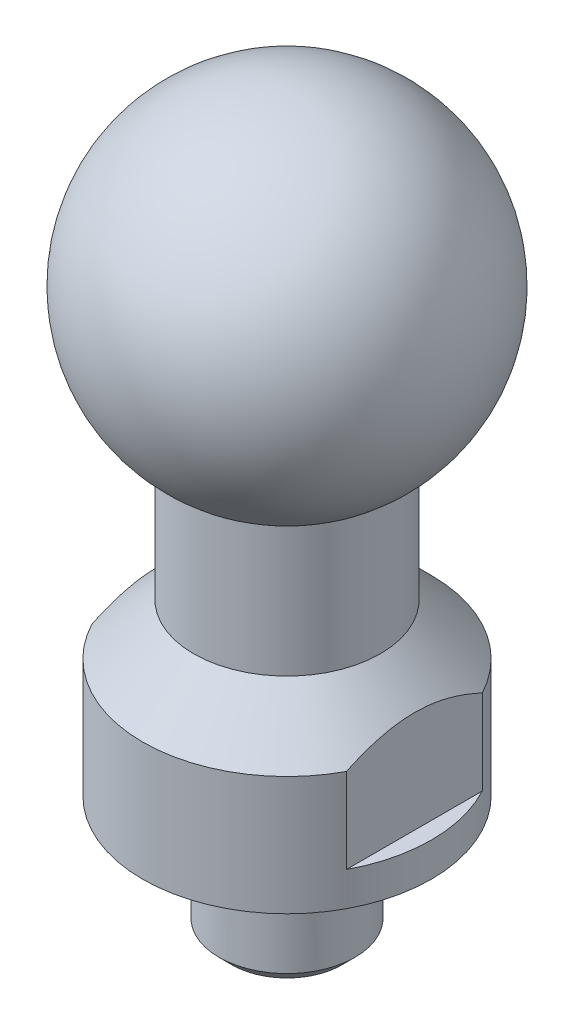
ISO-10303-21;
HEADER;
FILE_DESCRIPTION(('STEP AP214'),'2;1');
FILE_NAME('part.step','',(''),(''),'','','');
FILE_SCHEMA(('AUTOMOTIVE_DESIGN { 1 0 10303 214 1 1 1 1 }'));
ENDSEC;
DATA;
#1=APPLICATION_CONTEXT('core data for automotive mechanical design processes');
#2=APPLICATION_PROTOCOL_DEFINITION('international standard','automotive_design',2000,#1);
#3=PRODUCT_CONTEXT('',#1,'mechanical');
#4=PRODUCT('Part','Part','',(#3));
#5=PRODUCT_RELATED_PRODUCT_CATEGORY('part','',(#4));
#6=PRODUCT_DEFINITION_FORMATION('','',#4);
#7=PRODUCT_DEFINITION_CONTEXT('part definition',#1,'design');
#8=PRODUCT_DEFINITION('design','',#6,#7);
#9=PRODUCT_DEFINITION_SHAPE('','',#8);
#10=(LENGTH_UNIT() NAMED_UNIT(*) SI_UNIT(.MILLI.,.METRE.));
#11=(NAMED_UNIT(*) PLANE_ANGLE_UNIT() SI_UNIT($,.RADIAN.));
#12=(NAMED_UNIT(*) SI_UNIT($,.STERADIAN.) SOLID_ANGLE_UNIT());
#13=UNCERTAINTY_MEASURE_WITH_UNIT(LENGTH_MEASURE(1.E-05),#10,'distance_accuracy_value','');
#14=(GEOMETRIC_REPRESENTATION_CONTEXT(3) GLOBAL_UNCERTAINTY_ASSIGNED_CONTEXT((#13)) GLOBAL_UNIT_ASSIGNED_CONTEXT((#10,
#11,#12)) REPRESENTATION_CONTEXT('',''));
#15=CARTESIAN_POINT('',(0.,0.,0.));
#16=DIRECTION('',(0.,0.,1.));
#17=DIRECTION('',(1.,0.,0.));
#18=AXIS2_PLACEMENT_3D('',#15,#16,#17);
#19=CARTESIAN_POINT('',(-3.233,48.,-3.233));
#20=DIRECTION('',(0.,-1.,0.));
#21=DIRECTION('',(1.,0.,0.));
#22=AXIS2_PLACEMENT_3D('',#19,#20,#21);
#23=PLANE('',#22);
#24=CARTESIAN_POINT('',(0.,48.,0.));
#25=DIRECTION('',(0.,-1.,0.));
#26=DIRECTION('',(0.,0.,1.));
#27=AXIS2_PLACEMENT_3D('',#24,#25,#26);
#28=CIRCLE('',#27,3.233);
#29=CARTESIAN_POINT('',(0.,48.,3.233));
#30=VERTEX_POINT('',#29);
#31=EDGE_CURVE('E185',#30,#30,#28,.F.);
#32=ORIENTED_EDGE('',*,*,#31,.F.);
#33=EDGE_LOOP('',(#32));
#34=FACE_BOUND('',#33,.T.);
#35=ADVANCED_FACE('F17',(#34),#23,.T.);
#36=CARTESIAN_POINT('',(-8.73225364009987,55.,-8.5));
#37=DIRECTION('',(0.,-1.,0.));
#38=DIRECTION('',(1.,0.,0.));
#39=AXIS2_PLACEMENT_3D('',#36,#37,#38);
#40=PLANE('',#39);
#41=CARTESIAN_POINT('',(0.,55.,0.));
#42=DIRECTION('',(0.,-1.,0.));
#43=DIRECTION('',(0.,0.,1.));
#44=AXIS2_PLACEMENT_3D('',#41,#42,#43);
#45=CIRCLE('',#44,8.5);
#46=CARTESIAN_POINT('',(0.,55.,8.5));
#47=VERTEX_POINT('',#46);
#48=EDGE_CURVE('E80',#47,#47,#45,.F.);
#49=ORIENTED_EDGE('',*,*,#48,.F.);
#50=EDGE_LOOP('',(#49));
#51=FACE_BOUND('',#50,.T.);
#52=CARTESIAN_POINT('',(0.,55.,0.));
#53=DIRECTION('',(0.,1.,0.));
#54=DIRECTION('',(0.,0.,-1.));
#55=AXIS2_PLACEMENT_3D('',#52,#53,#54);
#56=CIRCLE('',#55,4.);
#57=CARTESIAN_POINT('',(0.,55.,-4.));
#58=VERTEX_POINT('',#57);
#59=EDGE_CURVE('E77',#58,#58,#56,.T.);
#60=ORIENTED_EDGE('',*,*,#59,.T.);
#61=EDGE_LOOP('',(#60));
#62=FACE_BOUND('',#61,.T.);
#63=ADVANCED_FACE('F103',(#51,#62),#40,.T.);
#64=CARTESIAN_POINT('',(-7.5,57.,4.00000000114937));
#65=DIRECTION('',(-1.,0.,0.));
#66=DIRECTION('',(0.,1.,0.));
#67=AXIS2_PLACEMENT_3D('',#64,#65,#66);
#68=PLANE('',#67);
#69=DIRECTION('',(0.,0.,1.));
#70=VECTOR('',#69,1.);
#71=CARTESIAN_POINT('',(-7.5,57.,-4.));
#72=LINE('',#71,#70);
#73=CARTESIAN_POINT('',(-7.5,57.,-4.));
#74=VERTEX_POINT('',#73);
#75=CARTESIAN_POINT('',(-7.5,57.,4.));
#76=VERTEX_POINT('',#75);
#77=EDGE_CURVE('E68',#74,#76,#72,.T.);
#78=ORIENTED_EDGE('',*,*,#77,.T.);
#79=DIRECTION('',(0.,1.,2.29873720086967E-10));
#80=VECTOR('',#79,1.);
#81=CARTESIAN_POINT('',(-7.5,57.,4.));
#82=LINE('',#81,#80);
#83=CARTESIAN_POINT('',(-7.5,61.9999999993918,4.00000000114937));
#84=VERTEX_POINT('',#83);
#85=EDGE_CURVE('E56',#84,#76,#82,.F.);
#86=ORIENTED_EDGE('',*,*,#85,.F.);
#87=CARTESIAN_POINT('',(-7.49999999999995,62.0000000219633,-3.99999995332805));
#88=CARTESIAN_POINT('',(-7.50000001463122,62.0168374619799,-3.96422028065112));
#89=CARTESIAN_POINT('',(-7.50000021288068,62.0335308730521,-3.92837273513309));
#90=CARTESIAN_POINT('',(-7.50000064954804,62.0667491959796,-3.85626007169311));
#91=CARTESIAN_POINT('',(-7.5000008882675,62.0832717742129,-3.8199938788956));
#92=CARTESIAN_POINT('',(-7.50000106891966,62.1161262201853,-3.74705105900949));
#93=CARTESIAN_POINT('',(-7.50000100863585,62.1324557614171,-3.71037338370133));
#94=CARTESIAN_POINT('',(-7.50000031502889,62.1649018458054,-3.63661397478704));
#95=CARTESIAN_POINT('',(-7.49999967765433,62.1810160644761,-3.59953121842838));
#96=CARTESIAN_POINT('',(-7.49999764228953,62.2130092056872,-3.52496716258381));
#97=CARTESIAN_POINT('',(-7.49999623918447,62.2288857999319,-3.48748486383744));
#98=CARTESIAN_POINT('',(-7.49999233042079,62.2603815436639,-3.41212641594515));
#99=CARTESIAN_POINT('',(-7.49998981766852,62.2759983548218,-3.37424928922651));
#100=CARTESIAN_POINT('',(-7.49998407200913,62.3069518277154,-3.29810472301365));
#101=CARTESIAN_POINT('',(-7.49998083469952,62.3222861287187,-3.25983632359907));
#102=CARTESIAN_POINT('',(-7.49997138039632,62.352547876092,-3.18318147215675));
#103=CARTESIAN_POINT('',(-7.49996516627001,62.3674756993924,-3.14479516897231));
#104=CARTESIAN_POINT('',(-7.49995122278917,62.3968132294981,-3.06816084079637));
#105=CARTESIAN_POINT('',(-7.49994350536442,62.4112260217123,-3.02991399737312));
#106=CARTESIAN_POINT('',(-7.4999298161044,62.4395362583751,-2.95353645677785));
#107=CARTESIAN_POINT('',(-7.49992383234945,62.4534366190715,-2.91540684092237));
#108=CARTESIAN_POINT('',(-7.49991519866905,62.4807253623381,-2.83924174399878));
#109=CARTESIAN_POINT('',(-7.49991252752266,62.4941164654708,-2.80120723798125));
#110=CARTESIAN_POINT('',(-7.49991134483756,62.520389930452,-2.72521019173225));
#111=CARTESIAN_POINT('',(-7.49991280922022,62.533274796182,-2.68724851740818));
#112=CARTESIAN_POINT('',(-7.4999197013677,62.5585390923869,-2.61137489292846));
#113=CARTESIAN_POINT('',(-7.49992510863815,62.5709207882467,-2.57346369732167));
#114=CARTESIAN_POINT('',(-7.49993875925235,62.5951820360946,-2.49766869498664));
#115=CARTESIAN_POINT('',(-7.49994698974328,62.6070635944275,-2.45978553064538));
#116=CARTESIAN_POINT('',(-7.49996406907078,62.6303279747492,-2.38402420860664));
#117=CARTESIAN_POINT('',(-7.49997291543268,62.641712524033,-2.34614658146009));
#118=CARTESIAN_POINT('',(-7.49998840174655,62.6639859671589,-2.27037379056723));
#119=CARTESIAN_POINT('',(-7.49999504847408,62.6748762922166,-2.23247904762039));
#120=CARTESIAN_POINT('',(-7.50000086739725,62.6961566652666,-2.15668184642589));
#121=CARTESIAN_POINT('',(-7.50000006375525,62.7065482206816,-2.11877981147924));
#122=CARTESIAN_POINT('',(-7.49998942224655,62.7267958212251,-2.04308193386561));
#123=CARTESIAN_POINT('',(-7.49997963981357,62.7366547596196,-2.00528686542144));
#124=CARTESIAN_POINT('',(-7.49995778978801,62.7558325263098,-1.92978971950365));
#125=CARTESIAN_POINT('',(-7.49994573557135,62.7651541187462,-1.89208834455705));
#126=CARTESIAN_POINT('',(-7.49992279335406,62.783259088784,-1.81674955317861));
#127=CARTESIAN_POINT('',(-7.49991189999037,62.7920448533838,-1.77911271063529));
#128=CARTESIAN_POINT('',(-7.49989384143082,62.8090796553806,-1.70387367108459));
#129=CARTESIAN_POINT('',(-7.49988666170669,62.817330672172,-1.66627192243619));
#130=CARTESIAN_POINT('',(-7.49987710755488,62.8332975746705,-1.59107363727844));
#131=CARTESIAN_POINT('',(-7.49987471867691,62.841015001605,-1.55347742814708));
#132=CARTESIAN_POINT('',(-7.49987428537818,62.8559164801745,-1.47826066980947));
#133=CARTESIAN_POINT('',(-7.49987623193273,62.8631016076748,-1.44064033382668));
#134=CARTESIAN_POINT('',(-7.4998832132571,62.8769396719196,-1.36534554224119));
#135=CARTESIAN_POINT('',(-7.49988824455781,62.883593197016,-1.32767119479529));
#136=CARTESIAN_POINT('',(-7.49989635252834,62.8963558271727,-1.25233147122707));
#137=CARTESIAN_POINT('',(-7.49989943426241,62.902466307035,-1.21466632803295));
#138=CARTESIAN_POINT('',(-7.49990111389451,62.9141230092742,-1.13946696246711));
#139=CARTESIAN_POINT('',(-7.49989973705763,62.9196722279591,-1.10193320473289));
#140=CARTESIAN_POINT('',(-7.49989438440453,62.9302077112456,-1.02699004645005));
#141=CARTESIAN_POINT('',(-7.49989042243359,62.9351968098005,-0.989581044487302));
#142=CARTESIAN_POINT('',(-7.4998805436856,62.9446147078005,-0.91487970352287));
#143=CARTESIAN_POINT('',(-7.49987463663167,62.949046145602,-0.877587697284088));
#144=CARTESIAN_POINT('',(-7.49986172419869,62.9573510922447,-0.803112595905516));
#145=CARTESIAN_POINT('',(-7.49985472391575,62.9612270373293,-0.765929772558849));
#146=CARTESIAN_POINT('',(-7.49984030346297,62.9684234544924,-0.69166530415843));
#147=CARTESIAN_POINT('',(-7.49983288514555,62.9717461533264,-0.654583874975737));
#148=CARTESIAN_POINT('',(-7.4998182300966,62.9778385199194,-0.580514480524382));
#149=CARTESIAN_POINT('',(-7.49981099279218,62.9806101991395,-0.543526680775037));
#150=CARTESIAN_POINT('',(-7.49979719624348,62.9856029795454,-0.469636869249525));
#151=CARTESIAN_POINT('',(-7.49979063483484,62.9878258721657,-0.432734978574346));
#152=CARTESIAN_POINT('',(-7.49977858939493,62.9917235353159,-0.359009362245951));
#153=CARTESIAN_POINT('',(-7.49977310230009,62.9933998737962,-0.322185719521686));
#154=CARTESIAN_POINT('',(-7.49976350745321,62.9962068881058,-0.24860904511678));
#155=CARTESIAN_POINT('',(-7.49975939631574,62.9973389062286,-0.211856064667534));
#156=CARTESIAN_POINT('',(-7.49975276143439,62.9990597409537,-0.138413245333529));
#157=CARTESIAN_POINT('',(-7.49975023443329,62.9996496733375,-0.101723432603114));
#158=CARTESIAN_POINT('',(-7.4997468858969,63.0002887982104,-0.0283995792438469));
#159=CARTESIAN_POINT('',(-7.49974606155724,63.000338880436,0.0082344536272907));
#160=CARTESIAN_POINT('',(-7.49974615167809,62.999900765751,0.0814540013830541));
#161=CARTESIAN_POINT('',(-7.49974706398997,62.9994132343069,0.118039520252274));
#162=CARTESIAN_POINT('',(-7.49975058230801,62.9979023508767,0.191169163635874));
#163=CARTESIAN_POINT('',(-7.49975318691038,62.9968794431367,0.227713297333299));
#164=CARTESIAN_POINT('',(-7.49975997364752,62.9943002622738,0.300767148637901));
#165=CARTESIAN_POINT('',(-7.49976415511009,62.9927442164502,0.337276874273833));
#166=CARTESIAN_POINT('',(-7.49977391677313,62.9891012099345,0.41026872776509));
#167=CARTESIAN_POINT('',(-7.49977949693201,62.9870142650241,0.446750856408446));
#168=CARTESIAN_POINT('',(-7.49979182399305,62.9823119050662,0.519694160024269));
#169=CARTESIAN_POINT('',(-7.49979857131285,62.9796963007852,0.556155322792042));
#170=CARTESIAN_POINT('',(-7.49981295790544,62.973939059985,0.629063150710036));
#171=CARTESIAN_POINT('',(-7.49982059783278,62.9707970366968,0.665509785305043));
#172=CARTESIAN_POINT('',(-7.49983646339281,62.9639893879984,0.738394811451343));
#173=CARTESIAN_POINT('',(-7.49984468966471,62.9603231866347,0.774833149183724));
#174=CARTESIAN_POINT('',(-7.49986140244177,62.9524696032783,0.84770762175242));
#175=CARTESIAN_POINT('',(-7.49986988931068,62.9482814652558,0.884143675077914));
#176=CARTESIAN_POINT('',(-7.49988679166888,62.939386420728,0.957019392125729));
#177=CARTESIAN_POINT('',(-7.49989520700094,62.9346785878636,0.993458942732044));
#178=CARTESIAN_POINT('',(-7.49991164243116,62.9247465558443,1.06634722890593));
#179=CARTESIAN_POINT('',(-7.49991966164241,62.9195212702643,1.1027958163735));
#180=CARTESIAN_POINT('',(-7.49993500337748,62.9085567245867,1.17570750082979));
#181=CARTESIAN_POINT('',(-7.49994232413429,62.9028162286564,1.21217041189954));
#182=CARTESIAN_POINT('',(-7.49995600535408,62.8908236432143,1.28511580744281));
#183=CARTESIAN_POINT('',(-7.49996236309829,62.8845701793953,1.32159806588689));
#184=CARTESIAN_POINT('',(-7.49997390833715,62.8715540282568,1.39458694944288));
#185=CARTESIAN_POINT('',(-7.49997909218611,62.8647898392491,1.431093306658));
#186=CARTESIAN_POINT('',(-7.49998815094411,62.8507545960025,1.50413490084196));
#187=CARTESIAN_POINT('',(-7.49999202142214,62.8434819238358,1.54066982680627));
#188=CARTESIAN_POINT('',(-7.4999983997606,62.8284320638267,1.61377278364178));
#189=CARTESIAN_POINT('',(-7.50000090266218,62.8206531529175,1.65034045965652));
#190=CARTESIAN_POINT('',(-7.50000460813351,62.8045931446547,1.72351284261498));
#191=CARTESIAN_POINT('',(-7.50000580566233,62.7963102300078,1.7601171505574));
#192=CARTESIAN_POINT('',(-7.50000704749022,62.7792445672295,1.83336642938422));
#193=CARTESIAN_POINT('',(-7.50000708706627,62.7704599184349,1.87001095730694));
#194=CARTESIAN_POINT('',(-7.50000644910689,62.7523929995572,1.94334396139627));
#195=CARTESIAN_POINT('',(-7.50000576849256,62.7431087553108,1.98003195102396));
#196=CARTESIAN_POINT('',(-7.50000373766662,62.7240453359998,2.0534549850294));
#197=CARTESIAN_POINT('',(-7.50000238446162,62.7142641254793,2.09018950078328));
#198=CARTESIAN_POINT('',(-7.50000130406047,62.6942076183826,2.16370785738439));
#199=CARTESIAN_POINT('',(-7.50000158449339,62.6839302262465,2.20049112634885));
#200=CARTESIAN_POINT('',(-7.49999850258677,62.662910734135,2.27403514096635));
#201=CARTESIAN_POINT('',(-7.49999513012314,62.6521674222576,2.31079554003957));
#202=CARTESIAN_POINT('',(-7.49997810367415,62.6302580294663,2.38419675665137));
#203=CARTESIAN_POINT('',(-7.49996444797883,62.6190918785334,2.42083755328389));
#204=CARTESIAN_POINT('',(-7.49993511443265,62.5963325645677,2.49402141010848));
#205=CARTESIAN_POINT('',(-7.49991943482414,62.5847390367092,2.53056435683159));
#206=CARTESIAN_POINT('',(-7.49988902839279,62.5611240473085,2.60357660544824));
#207=CARTESIAN_POINT('',(-7.49987430314278,62.5491019275468,2.64004569439442));
#208=CARTESIAN_POINT('',(-7.49984877464218,62.5246278339393,2.71293397177265));
#209=CARTESIAN_POINT('',(-7.4998379806181,62.5121749230217,2.74935284549129));
#210=CARTESIAN_POINT('',(-7.4998218910166,62.4868375729323,2.82216443893827));
#211=CARTESIAN_POINT('',(-7.49981661227599,62.4739519356063,2.8585567416198));
#212=CARTESIAN_POINT('',(-7.49981212492918,62.4477473746029,2.93133883891239));
#213=CARTESIAN_POINT('',(-7.49981293910988,62.4344270100797,2.96772811461766));
#214=CARTESIAN_POINT('',(-7.49982014927902,62.4073512177552,3.04052771170189));
#215=CARTESIAN_POINT('',(-7.49982656994466,62.393594125981,3.07693741402575));
#216=CARTESIAN_POINT('',(-7.49984337179488,62.3656431472362,3.14980134841688));
#217=CARTESIAN_POINT('',(-7.49985377296681,62.3514473938044,3.18625486428092));
#218=CARTESIAN_POINT('',(-7.49987621496644,62.3226170763066,3.25922969874048));
#219=CARTESIAN_POINT('',(-7.49988826485498,62.3079804626496,3.29575020733009));
#220=CARTESIAN_POINT('',(-7.4999093814174,62.2782673818433,3.36888259861162));
#221=CARTESIAN_POINT('',(-7.49991842862794,62.2631887090551,3.40549358488521));
#222=CARTESIAN_POINT('',(-7.49993270829738,62.23257129459,3.47886577504936));
#223=CARTESIAN_POINT('',(-7.49993790975204,62.2170298425338,3.51562584776661));
#224=CARTESIAN_POINT('',(-7.49994999746869,62.1854578229835,3.58935681010217));
#225=CARTESIAN_POINT('',(-7.49995689955331,62.1694239769934,3.62632629557568));
#226=CARTESIAN_POINT('',(-7.49996988357649,62.1368652499812,3.70048583393493));
#227=CARTESIAN_POINT('',(-7.49997595670831,62.1203370772316,3.73767444127901));
#228=CARTESIAN_POINT('',(-7.49998670812279,62.086786277869,3.81228093466893));
#229=CARTESIAN_POINT('',(-7.49999137166369,62.0697603396948,3.84969733102076));
#230=CARTESIAN_POINT('',(-7.49999804169047,62.0352109005745,3.92476821350388));
#231=CARTESIAN_POINT('',(-7.50000002025545,62.0176840779032,3.96242117112542));
#232=CARTESIAN_POINT('',(-7.49999999986583,61.9999999995438,4.00000000122092));
#233=B_SPLINE_CURVE_WITH_KNOTS('',3,(#87,#88,#89,#90,#91,#92,#93,#94,#95,#96,#97,#98,#99,#100,
#101,#102,#103,#104,#105,#106,#107,#108,#109,#110,#111,#112,#113,#114,#115,#116,#117,#118,#119,
#120,#121,#122,#123,#124,#125,#126,#127,#128,#129,#130,#131,#132,#133,#134,#135,#136,#137,#138,
#139,#140,#141,#142,#143,#144,#145,#146,#147,#148,#149,#150,#151,#152,#153,#154,#155,#156,#157,
#158,#159,#160,#161,#162,#163,#164,#165,#166,#167,#168,#169,#170,#171,#172,#173,#174,#175,#176,
#177,#178,#179,#180,#181,#182,#183,#184,#185,#186,#187,#188,#189,#190,#191,#192,#193,#194,#195,
#196,#197,#198,#199,#200,#201,#202,#203,#204,#205,#206,#207,#208,#209,#210,#211,#212,#213,#214,
#215,#216,#217,#218,#219,#220,#221,#222,#223,#224,#225,#226,#227,#228,#229,#230,#231,#232),
.UNSPECIFIED.,.F.,.F.,(4,2,2,2,2,2,2,2,2,2,2,2,2,2,2,2,2,2,2,2,2,2,2,2,2,2,2,2,2,2,2,2,2,2,2,2,
2,2,2,2,2,2,2,2,2,2,2,2,2,2,2,2,2,2,2,2,2,2,2,2,2,2,2,2,2,2,2,2,2,2,2,2,4),(0.,
0.118630154590591,0.238186647665221,0.358630733035815,0.479926997992822,0.602043577041708,
0.724952373722351,0.848629290104813,0.972187318721311,1.09480207536367,1.21655263450912,
1.33751914883329,1.45778280454752,1.57742576859305,1.6965311271427,1.81518281587662,
1.9334655426501,2.05136480014215,2.16854102594946,2.28504774961796,2.40099047609246,
2.51647612135798,2.63161290856519,2.74651024956889,2.86127861360982,2.97574761454335,
3.08956909927269,3.20278593594842,3.31544520251707,3.42759417434248,3.53928023583265,
3.65055079001802,3.76145316661057,3.87203452910274,3.98234178148621,4.09242147518346,
4.20231971678796,4.31208207720298,4.42175350275383,4.53137822882371,4.64099969653159,
4.75066047293024,4.86040217515696,4.97026539891854,5.08028965163719,5.19051329052733,
5.30097346581526,5.41170606925592,5.5227456880453,5.63412556417344,5.74587755921332,
5.85803212449558,5.97061827657853,6.0836635778877,6.19719412236981,6.31123452598187,
6.42580792181803,6.54069967480875,6.65561053690721,6.77062187248596,6.88581816957204,
7.00128311402521,7.11709952403779,7.23334929168028,7.35011333222023,7.46747154180305,
7.58550276394148,7.70428476511744,7.82401423818686,7.94490277510897,8.06698947362002,
8.1903120033153,8.31490737393749),.UNSPECIFIED.);
#234=CARTESIAN_POINT('',(-7.5,62.0000000219633,-3.99999995332806));
#235=VERTEX_POINT('',#234);
#236=EDGE_CURVE('E67',#235,#84,#233,.T.);
#237=ORIENTED_EDGE('',*,*,#236,.F.);
#238=DIRECTION('',(0.,-1.,-9.33438850999381E-09));
#239=VECTOR('',#238,1.);
#240=CARTESIAN_POINT('',(-7.5,62.0000000219633,-3.99999995332806));
#241=LINE('',#240,#239);
#242=EDGE_CURVE('E74',#74,#235,#241,.F.);
#243=ORIENTED_EDGE('',*,*,#242,.F.);
#244=EDGE_LOOP('',(#78,#86,#237,#243));
#245=FACE_BOUND('',#244,.T.);
#246=ADVANCED_FACE('F76',(#245),#68,.T.);
#247=CARTESIAN_POINT('',(-8.50213761414101,57.,-4.));
#248=DIRECTION('',(0.,1.,0.));
#249=DIRECTION('',(0.,0.,1.));
#250=AXIS2_PLACEMENT_3D('',#247,#248,#249);
#251=PLANE('',#250);
#252=ORIENTED_EDGE('',*,*,#77,.F.);
#253=CARTESIAN_POINT('',(0.,57.,0.));
#254=DIRECTION('',(0.,1.,0.));
#255=DIRECTION('',(-0.88235294117647,0.,-0.470588235294118));
#256=AXIS2_PLACEMENT_3D('',#253,#254,#255);
#257=CIRCLE('',#256,8.5);
#258=EDGE_CURVE('E61',#74,#76,#257,.T.);
#259=ORIENTED_EDGE('',*,*,#258,.T.);
#260=EDGE_LOOP('',(#252,#259));
#261=FACE_BOUND('',#260,.T.);
#262=ADVANCED_FACE('F72',(#261),#251,.T.);
#263=CARTESIAN_POINT('',(7.5,57.,-4.));
#264=DIRECTION('',(0.,1.,0.));
#265=DIRECTION('',(0.,0.,1.));
#266=AXIS2_PLACEMENT_3D('',#263,#264,#265);
#267=PLANE('',#266);
#268=CARTESIAN_POINT('',(0.,57.,0.));
#269=DIRECTION('',(0.,1.,0.));
#270=DIRECTION('',(0.882352941176471,0.,0.470588235294118));
#271=AXIS2_PLACEMENT_3D('',#268,#269,#270);
#272=CIRCLE('',#271,8.5);
#273=CARTESIAN_POINT('',(7.5,57.,4.));
#274=VERTEX_POINT('',#273);
#275=CARTESIAN_POINT('',(7.5,57.,-4.));
#276=VERTEX_POINT('',#275);
#277=EDGE_CURVE('E73',#274,#276,#272,.T.);
#278=ORIENTED_EDGE('',*,*,#277,.T.);
#279=DIRECTION('',(0.,0.,1.));
#280=VECTOR('',#279,1.);
#281=CARTESIAN_POINT('',(7.5,57.,-4.));
#282=LINE('',#281,#280);
#283=EDGE_CURVE('E282',#274,#276,#282,.F.);
#284=ORIENTED_EDGE('',*,*,#283,.F.);
#285=EDGE_LOOP('',(#278,#284));
#286=FACE_BOUND('',#285,.T.);
#287=ADVANCED_FACE('F107',(#286),#267,.T.);
#288=CARTESIAN_POINT('',(7.5,57.,-4.00000000114937));
#289=DIRECTION('',(1.,0.,0.));
#290=DIRECTION('',(0.,1.,0.));
#291=AXIS2_PLACEMENT_3D('',#288,#289,#290);
#292=PLANE('',#291);
#293=ORIENTED_EDGE('',*,*,#283,.T.);
#294=DIRECTION('',(0.,1.,-2.29873009544231E-10));
#295=VECTOR('',#294,1.);
#296=CARTESIAN_POINT('',(7.5,57.,-4.));
#297=LINE('',#296,#295);
#298=CARTESIAN_POINT('',(7.5,61.9999999993918,-4.00000000114937));
#299=VERTEX_POINT('',#298);
#300=EDGE_CURVE('E277',#299,#276,#297,.F.);
#301=ORIENTED_EDGE('',*,*,#300,.F.);
#302=CARTESIAN_POINT('',(7.49999999999998,62.0000000483132,3.99999989733445));
#303=CARTESIAN_POINT('',(7.50000001437722,62.0168374881242,3.96422022518066));
#304=CARTESIAN_POINT('',(7.50000021237777,62.0335308989909,3.92837268018561));
#305=CARTESIAN_POINT('',(7.5000006485554,62.0667492215096,3.85626001778816));
#306=CARTESIAN_POINT('',(7.50000088703413,62.0832717995395,3.81999382551014));
#307=CARTESIAN_POINT('',(7.50000106721305,62.1161262451075,3.74705100665899));
#308=CARTESIAN_POINT('',(7.5000010066968,62.1324557861382,3.71037333186625));
#309=CARTESIAN_POINT('',(7.50000031263326,62.1649018701271,3.63661392397823));
#310=CARTESIAN_POINT('',(7.49999967503461,62.1810160885994,3.59953116813038));
#311=CARTESIAN_POINT('',(7.49999763922996,62.2130092294168,3.52496711330227));
#312=CARTESIAN_POINT('',(7.49999623590921,62.228885823466,3.48748481506152));
#313=CARTESIAN_POINT('',(7.49999232672242,62.2603815668107,3.41212636817481));
#314=CARTESIAN_POINT('',(7.49998981376281,62.2759983777764,3.3742492419561));
#315=CARTESIAN_POINT('',(7.49998406769698,62.3069518502895,3.29810467673688));
#316=CARTESIAN_POINT('',(7.49998083018835,62.3222861511043,3.25983627781599));
#317=CARTESIAN_POINT('',(7.49997137549653,62.3525478981084,3.18318142734469));
#318=CARTESIAN_POINT('',(7.49996516118063,62.3674757212279,3.14479512463752));
#319=CARTESIAN_POINT('',(7.49995121733083,62.3968132509799,3.06816079739951));
#320=CARTESIAN_POINT('',(7.49994349972666,62.411226043021,3.02991395443684));
#321=CARTESIAN_POINT('',(7.49992981011754,62.4395362793453,2.95353641474592));
#322=CARTESIAN_POINT('',(7.49992382619286,62.4534366398761,2.91540679933415));
#323=CARTESIAN_POINT('',(7.49991519218213,62.4807253828194,2.83924170328095));
#324=CARTESIAN_POINT('',(7.49991252087512,62.494116485794,2.80120719769005));
#325=CARTESIAN_POINT('',(7.49991133787738,62.5203899504669,2.72521015227712));
#326=CARTESIAN_POINT('',(7.49991280210797,62.5332748160463,2.68724847836243));
#327=CARTESIAN_POINT('',(7.49991969395937,62.5585391119575,2.61137485468408));
#328=CARTESIAN_POINT('',(7.49992510108575,62.5709208076741,2.57346365946923));
#329=CARTESIAN_POINT('',(7.49993875141928,62.5951820552429,2.49766865790053));
#330=CARTESIAN_POINT('',(7.49994698177357,62.6070636134398,2.4597854939336));
#331=CARTESIAN_POINT('',(7.49996406083465,62.6303279934969,2.38402417262581));
#332=CARTESIAN_POINT('',(7.49997290706674,62.6417125426518,2.34614654583582));
#333=CARTESIAN_POINT('',(7.49998839312727,62.6639859855273,2.27037375563818));
#334=CARTESIAN_POINT('',(7.49999503973124,62.6748763104632,2.23247901302994));
#335=CARTESIAN_POINT('',(7.50000085841305,62.6961566832774,2.15668181249288));
#336=CARTESIAN_POINT('',(7.50000005465323,62.7065482385781,2.11877977786501));
#337=CARTESIAN_POINT('',(7.49998941291436,62.7267958389006,2.04308190086932));
#338=CARTESIAN_POINT('',(7.49997963036899,62.7366547771882,2.00528683272426));
#339=CARTESIAN_POINT('',(7.49995778012391,62.7558325436716,1.92978968738523));
#340=CARTESIAN_POINT('',(7.49994572580008,62.7651541360078,1.89208831271824));
#341=CARTESIAN_POINT('',(7.49992278337326,62.7832591058522,1.81674952187853));
#342=CARTESIAN_POINT('',(7.4999118899072,62.7920448703584,1.77911267959426));
#343=CARTESIAN_POINT('',(7.49989383114726,62.8090796721746,1.7038736405401));
#344=CARTESIAN_POINT('',(7.49988665132511,62.8173306888787,1.66627189212911));
#345=CARTESIAN_POINT('',(7.49987709698107,62.8332975912091,1.59107360742354));
#346=CARTESIAN_POINT('',(7.49987470800887,62.8410150180623,1.55347739850688));
#347=CARTESIAN_POINT('',(7.499874274525,62.8559164964757,1.47826064057494));
#348=CARTESIAN_POINT('',(7.49987622098862,62.8631016239005,1.44064030478304));
#349=CARTESIAN_POINT('',(7.49988320213349,62.8769396880007,1.36534551355453));
#350=CARTESIAN_POINT('',(7.49988823334563,62.8835932130276,1.32767116627465));
#351=CARTESIAN_POINT('',(7.49989634114186,62.8963558430487,1.25233144302127));
#352=CARTESIAN_POINT('',(7.49989942279017,62.9024663228448,1.21466629997592));
#353=CARTESIAN_POINT('',(7.49990110225578,62.9141230249501,1.13946693470722));
#354=CARTESIAN_POINT('',(7.49989972533812,62.9196722435674,1.10193317712137));
#355=CARTESIAN_POINT('',(7.49989437252804,62.9302077267175,1.02699001913544));
#356=CARTESIAN_POINT('',(7.49989041048087,62.9351968252037,0.989581017321221));
#357=CARTESIAN_POINT('',(7.49988053158515,62.9446147230649,0.914879676654144));
#358=CARTESIAN_POINT('',(7.4998746244597,62.9490461607964,0.877587670564179));
#359=CARTESIAN_POINT('',(7.49986171188844,62.9573511072977,0.803112569483659));
#360=CARTESIAN_POINT('',(7.4998547115387,62.961227052311,0.765929746286223));
#361=CARTESIAN_POINT('',(7.49984029095718,62.9684234693301,0.691665278184802));
#362=CARTESIAN_POINT('',(7.49983287257778,62.9717461680914,0.654583849151871));
#363=CARTESIAN_POINT('',(7.49981821740976,62.9778385345376,0.580514455000703));
#364=CARTESIAN_POINT('',(7.49981098004824,62.9806102136836,0.543526655401779));
#365=CARTESIAN_POINT('',(7.49979718339033,62.9856029939398,0.469636844177894));
#366=CARTESIAN_POINT('',(7.49979062192954,62.9878258864845,0.432734953653918));
#367=CARTESIAN_POINT('',(7.49977857639043,62.991723549482,0.359009337628837));
#368=CARTESIAN_POINT('',(7.49977308924853,62.9933998878852,0.322185695056679));
#369=CARTESIAN_POINT('',(7.49976349431267,62.996206902039,0.24860902095701));
#370=CARTESIAN_POINT('',(7.49975938313329,62.9973389200831,0.211856040660893));
#371=CARTESIAN_POINT('',(7.49975274817343,62.9990597546491,0.138413221634294));
#372=CARTESIAN_POINT('',(7.49975022113571,62.9996496869527,0.101723409058157));
#373=CARTESIAN_POINT('',(7.4997468725315,63.0002888116631,0.0283995560087026));
#374=CARTESIAN_POINT('',(7.49974604816063,63.0003388938067,-0.00823447670690093));
#375=CARTESIAN_POINT('',(7.49974613822463,62.9999007789558,-0.0814540241502061));
#376=CARTESIAN_POINT('',(7.49974705051085,62.9994132474279,-0.118039542862503));
#377=CARTESIAN_POINT('',(7.49975056878328,62.9979023638283,-0.191169185930763));
#378=CARTESIAN_POINT('',(7.49975317336569,62.9968794560026,-0.227713319469772));
#379=CARTESIAN_POINT('',(7.49975996006879,62.9943002749667,-0.300767170455921));
#380=CARTESIAN_POINT('',(7.49976414151727,62.9927442290557,-0.337276895931819));
#381=CARTESIAN_POINT('',(7.49977390315815,62.9891012223631,-0.410268749101274));
#382=CARTESIAN_POINT('',(7.49977948330897,62.9870142773633,-0.446750877582864));
#383=CARTESIAN_POINT('',(7.4997918103601,62.9823119172246,-0.519694180873302));
#384=CARTESIAN_POINT('',(7.49979855767807,62.9796963128522,-0.556155343477458));
#385=CARTESIAN_POINT('',(7.49981294427337,62.9739390718672,-0.629063171066249));
#386=CARTESIAN_POINT('',(7.49982058420527,62.9707970484856,-0.665509805495671));
#387=CARTESIAN_POINT('',(7.49983644978103,62.9639893995983,-0.738394831308716));
#388=CARTESIAN_POINT('',(7.49984467606412,62.9603231981391,-0.774833168873424));
#389=CARTESIAN_POINT('',(7.49986138887035,62.9524696145895,-0.847707641104573));
#390=CARTESIAN_POINT('',(7.49986987575727,62.9482814764694,-0.884143694260191));
#391=CARTESIAN_POINT('',(7.49988677815853,62.9393864317442,-0.957019410965939));
#392=CARTESIAN_POINT('',(7.49989519351566,62.93467859878,-0.993458961400061));
#393=CARTESIAN_POINT('',(7.4999116290033,62.9247465665587,-1.06634724722712));
#394=CARTESIAN_POINT('',(7.49991964824692,62.9195212808766,-1.10279583452005));
#395=CARTESIAN_POINT('',(7.49993499005427,62.9085567349925,-1.17570751862451));
#396=CARTESIAN_POINT('',(7.49994231085099,62.9028162389577,-1.21217042951707));
#397=CARTESIAN_POINT('',(7.49995599215842,62.8908236533045,-1.28511582470327));
#398=CARTESIAN_POINT('',(7.49996234995038,62.8845701893787,-1.32159808296748));
#399=CARTESIAN_POINT('',(7.49997389529278,62.8715540380242,-1.39458696616094));
#400=CARTESIAN_POINT('',(7.49997907919757,62.8647898489074,-1.43109332319339));
#401=CARTESIAN_POINT('',(7.4999881380756,62.8507546054399,-1.5041349170091));
#402=CARTESIAN_POINT('',(7.49999200861784,62.8434819331615,-1.54066984278781));
#403=CARTESIAN_POINT('',(7.4999983870934,62.8284320729265,-1.6137727992491));
#404=CARTESIAN_POINT('',(7.50000089006789,62.820653161903,-1.65034047507521));
#405=CARTESIAN_POINT('',(7.500004595694,62.8045931534093,-1.72351285765325));
#406=CARTESIAN_POINT('',(7.50000579330472,62.7963102386455,-1.76011716540387));
#407=CARTESIAN_POINT('',(7.50000703530573,62.779244575631,-1.83336644384382));
#408=CARTESIAN_POINT('',(7.50000707497302,62.770459926717,-1.87001097157145));
#409=CARTESIAN_POINT('',(7.50000643720576,62.7523930075976,-1.94334397526721));
#410=CARTESIAN_POINT('',(7.50000575669234,62.7431087632291,-1.9800319646964));
#411=CARTESIAN_POINT('',(7.50000372607822,62.7240453436711,-2.05345499830131));
#412=CARTESIAN_POINT('',(7.50000237298417,62.7142641330256,-2.09018951385314));
#413=CARTESIAN_POINT('',(7.50000129281527,62.6942076256763,-2.1637078700465));
#414=CARTESIAN_POINT('',(7.50000157336952,62.6839302334125,-2.20049113880523));
#415=CARTESIAN_POINT('',(7.49999849171611,62.6629107410442,-2.27403515300325));
#416=CARTESIAN_POINT('',(7.49999511938439,62.6521674290379,-2.31079555186273));
#417=CARTESIAN_POINT('',(7.49997809321124,62.6302580359863,-2.38419676803954));
#418=CARTESIAN_POINT('',(7.49996443765985,62.6190918849221,-2.42083756445084));
#419=CARTESIAN_POINT('',(7.49993510441343,62.5963325706919,-2.49402142082626));
#420=CARTESIAN_POINT('',(7.49991942496075,62.5847390427001,-2.53056436732143));
#421=CARTESIAN_POINT('',(7.49988901885332,62.5611240530306,-2.60357661547579));
#422=CARTESIAN_POINT('',(7.4998742937714,62.5491019331335,-2.64004570418762));
#423=CARTESIAN_POINT('',(7.49984876561942,62.524627839253,-2.71293398109106));
#424=CARTESIAN_POINT('',(7.4998379717759,62.5121749281979,-2.74935285456926));
#425=CARTESIAN_POINT('',(7.49982188254816,62.4868375778311,-2.82216444752963));
#426=CARTESIAN_POINT('',(7.4998166040008,62.4739519403653,-2.85855674996498));
#427=CARTESIAN_POINT('',(7.49981211705334,62.4477473790803,-2.93133884675978));
#428=CARTESIAN_POINT('',(7.49981293144019,62.4344270144151,-2.96772812221344));
#429=CARTESIAN_POINT('',(7.49982014203469,62.4073512218046,-3.04052771878934));
#430=CARTESIAN_POINT('',(7.4998265629196,62.3935941298863,-3.07693742085649));
#431=CARTESIAN_POINT('',(7.4998433652216,62.3656431508509,-3.14980135472942));
#432=CARTESIAN_POINT('',(7.49985376662611,62.3514473972728,-3.18625487033196));
#433=CARTESIAN_POINT('',(7.49987620910434,62.32261707948,-3.2592297042641));
#434=CARTESIAN_POINT('',(7.49988825923899,62.3079804656744,-3.29575021258776));
#435=CARTESIAN_POINT('',(7.49990937630716,62.2782673845687,-3.36888260333332));
#436=CARTESIAN_POINT('',(7.49991842377744,62.2631887116297,-3.40549358933687));
#437=CARTESIAN_POINT('',(7.49993270398066,62.2325712968597,-3.47886577895809));
#438=CARTESIAN_POINT('',(7.49993790570947,62.2170298446496,-3.51562585140241));
#439=CARTESIAN_POINT('',(7.4999499939897,62.1854578247874,-3.58935681318926));
#440=CARTESIAN_POINT('',(7.49995689636389,62.1694239786395,-3.62632629838695));
#441=CARTESIAN_POINT('',(7.49996988098175,62.136865251308,-3.70048583619172));
#442=CARTESIAN_POINT('',(7.49997595441883,62.1203370783969,-3.7376744432571));
#443=CARTESIAN_POINT('',(7.49998670645982,62.0867862787074,-3.81228093608678));
#444=CARTESIAN_POINT('',(7.49999137032212,62.0697603403678,-3.84969733215703));
#445=CARTESIAN_POINT('',(7.49999804100806,62.0352109009131,-3.92476821407417));
#446=CARTESIAN_POINT('',(7.50000001991096,62.0176840780727,-3.96242117141126));
#447=CARTESIAN_POINT('',(7.49999999986583,61.9999999995438,-4.00000000122092));
#448=B_SPLINE_CURVE_WITH_KNOTS('',3,(#302,#303,#304,#305,#306,#307,#308,#309,#310,#311,#312,
#313,#314,#315,#316,#317,#318,#319,#320,#321,#322,#323,#324,#325,#326,#327,#328,#329,#330,#331,
#332,#333,#334,#335,#336,#337,#338,#339,#340,#341,#342,#343,#344,#345,#346,#347,#348,#349,#350,
#351,#352,#353,#354,#355,#356,#357,#358,#359,#360,#361,#362,#363,#364,#365,#366,#367,#368,#369,
#370,#371,#372,#373,#374,#375,#376,#377,#378,#379,#380,#381,#382,#383,#384,#385,#386,#387,#388,
#389,#390,#391,#392,#393,#394,#395,#396,#397,#398,#399,#400,#401,#402,#403,#404,#405,#406,#407,
#408,#409,#410,#411,#412,#413,#414,#415,#416,#417,#418,#419,#420,#421,#422,#423,#424,#425,#426,
#427,#428,#429,#430,#431,#432,#433,#434,#435,#436,#437,#438,#439,#440,#441,#442,#443,#444,#445,
#446,#447),.UNSPECIFIED.,.F.,.F.,(4,2,2,2,2,2,2,2,2,2,2,2,2,2,2,2,2,2,2,2,2,2,2,2,2,2,2,2,2,2,2,
2,2,2,2,2,2,2,2,2,2,2,2,2,2,2,2,2,2,2,2,2,2,2,2,2,2,2,2,2,2,2,2,2,2,2,2,2,2,2,2,2,4),(0.,
0.118630152908011,0.23818664431136,0.358630728023992,0.479926991338337,0.602043568761848,
0.7249523638363,0.848629278633641,0.972187305719114,1.09480206088541,1.21655261861025,
1.33751913156976,1.45778278597579,1.57742574877012,1.69653110612605,1.81518279372422,
1.93346551942043,2.05136477589952,2.16854100075772,2.28504772353991,2.40099044919385,
2.5164760937076,2.6316128802349,2.74651022063364,2.86127858414774,2.97574758460887,
3.08956906886819,3.20278590507495,3.31544517117548,3.42759414253342,3.53928020355663,
3.65055075727538,3.76145313340149,3.87203449542727,3.98234174734428,4.09242144057485,
4.20231968171236,4.31208204165997,4.42175346674288,4.53137819234422,4.64099965958286,
4.75066043551148,4.8604021372673,4.97026536055703,5.0802896128028,5.19051325121897,
5.30097342603173,5.41170602899595,5.52274564730757,5.63412552295654,5.74587751751574,
5.85803208231575,5.9706182339148,6.08366353473833,6.19719407873298,6.31123448185569,
6.4258078772005,6.54069962968418,6.65561049126238,6.77062182631,6.88581812285532,
7.00128306675931,7.11709947621549,7.23334924329548,7.35011328326788,7.46747149227917,
7.58550271384308,7.70428471444244,7.82401418693772,7.94490272328916,8.06698942123313,
8.19031195036506,8.31490732042779),.UNSPECIFIED.);
#449=CARTESIAN_POINT('',(7.5,62.0000000483132,3.99999989733446));
#450=VERTEX_POINT('',#449);
#451=EDGE_CURVE('E36',#450,#299,#448,.T.);
#452=ORIENTED_EDGE('',*,*,#451,.F.);
#453=DIRECTION('',(0.,-1.,2.05331081707321E-08));
#454=VECTOR('',#453,1.);
#455=CARTESIAN_POINT('',(7.5,62.0000000483132,3.99999989733446));
#456=LINE('',#455,#454);
#457=EDGE_CURVE('E124',#274,#450,#456,.F.);
#458=ORIENTED_EDGE('',*,*,#457,.F.);
#459=EDGE_LOOP('',(#293,#301,#452,#458));
#460=FACE_BOUND('',#459,.T.);
#461=ADVANCED_FACE('F110',(#460),#292,.T.);
#462=CARTESIAN_POINT('',(0.,48.767,0.));
#463=DIRECTION('',(0.,1.,0.));
#464=DIRECTION('',(1.92368910030691E-10,0.,-1.));
#465=AXIS2_PLACEMENT_3D('',#462,#463,#464);
#466=CONICAL_SURFACE('',#465,3.99999999999999,0.785398163397446);
#467=CARTESIAN_POINT('',(0.,48.767,0.));
#468=DIRECTION('',(0.,-1.,0.));
#469=DIRECTION('',(0.,0.,1.));
#470=AXIS2_PLACEMENT_3D('',#467,#468,#469);
#471=CIRCLE('',#470,3.99999999999999);
#472=CARTESIAN_POINT('',(0.,48.767,3.99999999999999));
#473=VERTEX_POINT('',#472);
#474=EDGE_CURVE('E131',#473,#473,#471,.F.);
#475=ORIENTED_EDGE('',*,*,#474,.F.);
#476=EDGE_LOOP('',(#475));
#477=FACE_BOUND('',#476,.T.);
#478=ORIENTED_EDGE('',*,*,#31,.T.);
#479=EDGE_LOOP('',(#478));
#480=FACE_BOUND('',#479,.T.);
#481=ADVANCED_FACE('F115',(#477,#480),#466,.T.);
#482=CARTESIAN_POINT('',(0.,91.,0.));
#483=DIRECTION('',(0.,1.,0.));
#484=DIRECTION('',(7.69475716817933E-10,0.,-1.));
#485=AXIS2_PLACEMENT_3D('',#482,#483,#484);
#486=CYLINDRICAL_SURFACE('',#485,4.);
#487=ORIENTED_EDGE('',*,*,#59,.F.);
#488=EDGE_LOOP('',(#487));
#489=FACE_BOUND('',#488,.T.);
#490=ORIENTED_EDGE('',*,*,#474,.T.);
#491=EDGE_LOOP('',(#490));
#492=FACE_BOUND('',#491,.T.);
#493=ADVANCED_FACE('F193',(#489,#492),#486,.T.);
#494=CARTESIAN_POINT('',(0.,91.,0.));
#495=DIRECTION('',(0.,1.,0.));
#496=DIRECTION('',(0.,0.,-1.));
#497=AXIS2_PLACEMENT_3D('',#494,#495,#496);
#498=CYLINDRICAL_SURFACE('',#497,8.5);
#499=ORIENTED_EDGE('',*,*,#258,.F.);
#500=ORIENTED_EDGE('',*,*,#242,.T.);
#501=CARTESIAN_POINT('',(0.,62.0000000219633,0.));
#502=DIRECTION('',(0.,-1.,0.));
#503=DIRECTION('',(-0.882352943456392,0.,-0.470588231019265));
#504=AXIS2_PLACEMENT_3D('',#501,#502,#503);
#505=CIRCLE('',#504,8.5);
#506=EDGE_CURVE('E136',#299,#235,#505,.F.);
#507=ORIENTED_EDGE('',*,*,#506,.F.);
#508=ORIENTED_EDGE('',*,*,#300,.T.);
#509=ORIENTED_EDGE('',*,*,#277,.F.);
#510=ORIENTED_EDGE('',*,*,#457,.T.);
#511=CARTESIAN_POINT('',(0.,62.0000000483132,0.));
#512=DIRECTION('',(0.,-1.,0.));
#513=DIRECTION('',(0.882352946191681,0.,0.470588225890599));
#514=AXIS2_PLACEMENT_3D('',#511,#512,#513);
#515=CIRCLE('',#514,8.5);
#516=EDGE_CURVE('E32',#84,#450,#515,.F.);
#517=ORIENTED_EDGE('',*,*,#516,.F.);
#518=ORIENTED_EDGE('',*,*,#85,.T.);
#519=EDGE_LOOP('',(#499,#500,#507,#508,#509,#510,#517,#518));
#520=FACE_BOUND('',#519,.T.);
#521=ORIENTED_EDGE('',*,*,#48,.T.);
#522=EDGE_LOOP('',(#521));
#523=FACE_BOUND('',#522,.T.);
#524=ADVANCED_FACE('F58',(#520,#523),#498,.T.);
#525=CARTESIAN_POINT('',(0.,61.9999999993918,0.));
#526=DIRECTION('',(0.,-1.,0.));
#527=DIRECTION('',(0.,0.,1.));
#528=AXIS2_PLACEMENT_3D('',#525,#526,#527);
#529=CONICAL_SURFACE('',#528,8.50000000060822,0.785398163397447);
#530=CARTESIAN_POINT('',(0.,65.,0.));
#531=DIRECTION('',(0.,-1.,0.));
#532=DIRECTION('',(0.,0.,1.));
#533=AXIS2_PLACEMENT_3D('',#530,#531,#532);
#534=CIRCLE('',#533,5.50000000000001);
#535=CARTESIAN_POINT('',(0.,65.,5.50000000000001));
#536=VERTEX_POINT('',#535);
#537=EDGE_CURVE('E25',#536,#536,#534,.F.);
#538=ORIENTED_EDGE('',*,*,#537,.F.);
#539=EDGE_LOOP('',(#538));
#540=FACE_BOUND('',#539,.T.);
#541=ORIENTED_EDGE('',*,*,#506,.T.);
#542=ORIENTED_EDGE('',*,*,#236,.T.);
#543=ORIENTED_EDGE('',*,*,#516,.T.);
#544=ORIENTED_EDGE('',*,*,#451,.T.);
#545=EDGE_LOOP('',(#541,#542,#543,#544));
#546=FACE_BOUND('',#545,.T.);
#547=ADVANCED_FACE('F149',(#540,#546),#529,.T.);
#548=CARTESIAN_POINT('',(0.,91.,0.));
#549=DIRECTION('',(0.,1.,0.));
#550=DIRECTION('',(0.,0.,-1.));
#551=AXIS2_PLACEMENT_3D('',#548,#549,#550);
#552=CYLINDRICAL_SURFACE('',#551,5.5);
#553=CARTESIAN_POINT('',(0.,72.648353455755,0.));
#554=DIRECTION('',(0.,-1.,0.));
#555=DIRECTION('',(-1.,0.,0.));
#556=AXIS2_PLACEMENT_3D('',#553,#554,#555);
#557=CIRCLE('',#556,5.5);
#558=CARTESIAN_POINT('',(-5.5,72.648353455755,0.));
#559=VERTEX_POINT('',#558);
#560=EDGE_CURVE('E11',#559,#559,#557,.F.);
#561=ORIENTED_EDGE('',*,*,#560,.F.);
#562=EDGE_LOOP('',(#561));
#563=FACE_BOUND('',#562,.T.);
#564=ORIENTED_EDGE('',*,*,#537,.T.);
#565=EDGE_LOOP('',(#564));
#566=FACE_BOUND('',#565,.T.);
#567=ADVANCED_FACE('F158',(#563,#566),#552,.T.);
#568=CARTESIAN_POINT('',(0.,81.,0.));
#569=DIRECTION('',(0.,1.,0.));
#570=DIRECTION('',(-1.,0.,0.));
#571=AXIS2_PLACEMENT_3D('',#568,#569,#570);
#572=SPHERICAL_SURFACE('',#571,10.);
#573=ORIENTED_EDGE('',*,*,#560,.T.);
#574=EDGE_LOOP('',(#573));
#575=FACE_BOUND('',#574,.T.);
#576=ADVANCED_FACE('F19',(#575),#572,.T.);
#577=CLOSED_SHELL('',(#35,#63,#246,#262,#287,#461,#481,#493,#524,#547,#567,#576));
#578=MANIFOLD_SOLID_BREP('B1',#577);
#579=ADVANCED_BREP_SHAPE_REPRESENTATION('',(#18,#578),#14);
#580=SHAPE_DEFINITION_REPRESENTATION(#9,#579);
ENDSEC;
END-ISO-10303-21;
